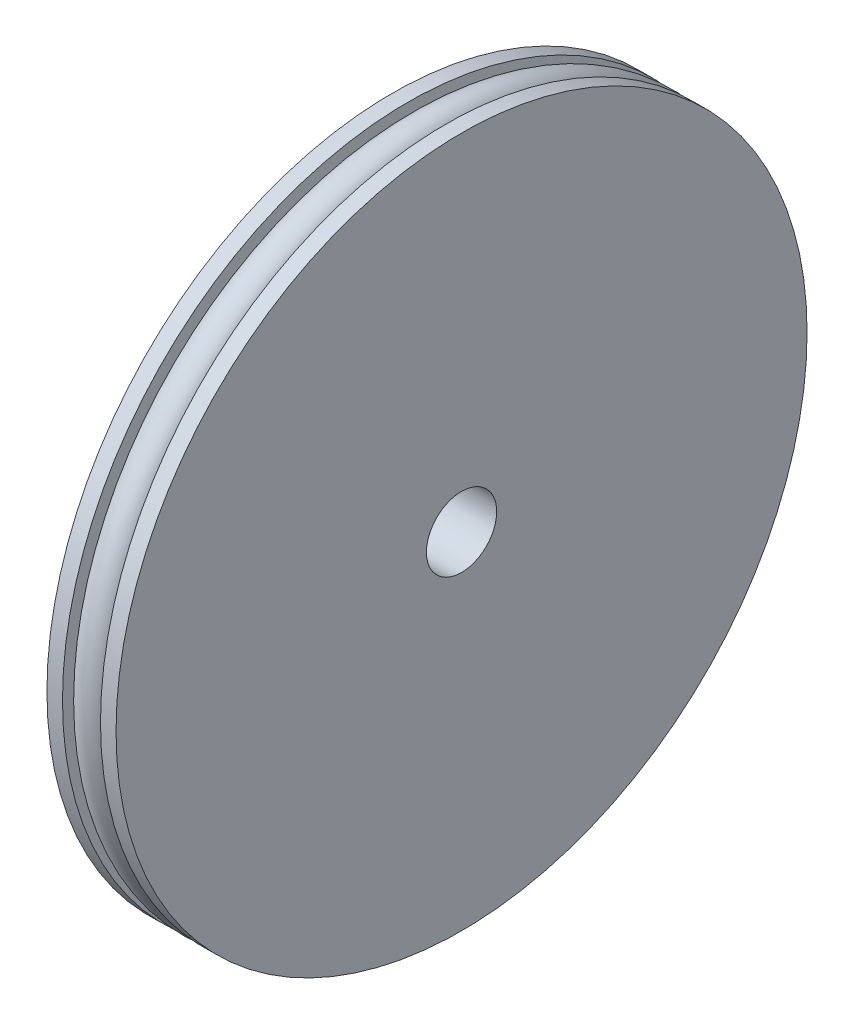
ISO-10303-21;
HEADER;
FILE_DESCRIPTION(('STEP AP214'),'2;1');
FILE_NAME('part.step','',(''),(''),'','','');
FILE_SCHEMA(('AUTOMOTIVE_DESIGN { 1 0 10303 214 1 1 1 1 }'));
ENDSEC;
DATA;
#1=APPLICATION_CONTEXT('core data for automotive mechanical design processes');
#2=APPLICATION_PROTOCOL_DEFINITION('international standard','automotive_design',2000,#1);
#3=PRODUCT_CONTEXT('',#1,'mechanical');
#4=PRODUCT('Part','Part','',(#3));
#5=PRODUCT_RELATED_PRODUCT_CATEGORY('part','',(#4));
#6=PRODUCT_DEFINITION_FORMATION('','',#4);
#7=PRODUCT_DEFINITION_CONTEXT('part definition',#1,'design');
#8=PRODUCT_DEFINITION('design','',#6,#7);
#9=PRODUCT_DEFINITION_SHAPE('','',#8);
#10=(LENGTH_UNIT() NAMED_UNIT(*) SI_UNIT(.MILLI.,.METRE.));
#11=(NAMED_UNIT(*) PLANE_ANGLE_UNIT() SI_UNIT($,.RADIAN.));
#12=(NAMED_UNIT(*) SI_UNIT($,.STERADIAN.) SOLID_ANGLE_UNIT());
#13=UNCERTAINTY_MEASURE_WITH_UNIT(LENGTH_MEASURE(1.E-05),#10,'distance_accuracy_value','');
#14=(GEOMETRIC_REPRESENTATION_CONTEXT(3) GLOBAL_UNCERTAINTY_ASSIGNED_CONTEXT((#13)) GLOBAL_UNIT_ASSIGNED_CONTEXT((#10,
#11,#12)) REPRESENTATION_CONTEXT('',''));
#15=CARTESIAN_POINT('',(0.,0.,0.));
#16=DIRECTION('',(0.,0.,1.));
#17=DIRECTION('',(1.,0.,0.));
#18=AXIS2_PLACEMENT_3D('',#15,#16,#17);
#19=CARTESIAN_POINT('',(-10.3308856444655,0.,0.));
#20=DIRECTION('',(-1.,0.,0.));
#21=DIRECTION('',(0.,0.,1.));
#22=AXIS2_PLACEMENT_3D('',#19,#20,#21);
#23=CYLINDRICAL_SURFACE('',#22,25.);
#24=CARTESIAN_POINT('',(1.35,0.,0.));
#25=DIRECTION('',(-1.,0.,0.));
#26=DIRECTION('',(0.,0.,1.));
#27=AXIS2_PLACEMENT_3D('',#24,#25,#26);
#28=CIRCLE('',#27,25.);
#29=CARTESIAN_POINT('',(1.35,0.,25.));
#30=VERTEX_POINT('',#29);
#31=EDGE_CURVE('E55',#30,#30,#28,.T.);
#32=ORIENTED_EDGE('',*,*,#31,.T.);
#33=EDGE_LOOP('',(#32));
#34=FACE_BOUND('',#33,.T.);
#35=CARTESIAN_POINT('',(4.65,0.,0.));
#36=DIRECTION('',(-1.,0.,0.));
#37=DIRECTION('',(0.,0.,1.));
#38=AXIS2_PLACEMENT_3D('',#35,#36,#37);
#39=CIRCLE('',#38,25.);
#40=CARTESIAN_POINT('',(4.65,0.,25.));
#41=VERTEX_POINT('',#40);
#42=EDGE_CURVE('E11',#41,#41,#39,.T.);
#43=ORIENTED_EDGE('',*,*,#42,.F.);
#44=EDGE_LOOP('',(#43));
#45=FACE_BOUND('',#44,.T.);
#46=ADVANCED_FACE('F41',(#34,#45),#23,.F.);
#47=CARTESIAN_POINT('',(4.65,25.,0.));
#48=DIRECTION('',(-1.,0.,0.));
#49=DIRECTION('',(0.,0.,1.));
#50=AXIS2_PLACEMENT_3D('',#47,#48,#49);
#51=PLANE('',#50);
#52=CARTESIAN_POINT('',(4.65,0.,0.));
#53=DIRECTION('',(-1.,0.,0.));
#54=DIRECTION('',(0.,0.,1.));
#55=AXIS2_PLACEMENT_3D('',#52,#53,#54);
#56=CIRCLE('',#55,28.35);
#57=CARTESIAN_POINT('',(4.65,0.,28.35));
#58=VERTEX_POINT('',#57);
#59=EDGE_CURVE('E47',#58,#58,#56,.T.);
#60=ORIENTED_EDGE('',*,*,#59,.F.);
#61=EDGE_LOOP('',(#60));
#62=FACE_BOUND('',#61,.T.);
#63=ORIENTED_EDGE('',*,*,#42,.T.);
#64=EDGE_LOOP('',(#63));
#65=FACE_BOUND('',#64,.T.);
#66=ADVANCED_FACE('F71',(#62,#65),#51,.F.);
#67=CARTESIAN_POINT('',(3.,0.,0.));
#68=DIRECTION('',(-1.,0.,0.));
#69=DIRECTION('',(0.,0.,1.));
#70=AXIS2_PLACEMENT_3D('',#67,#68,#69);
#71=TOROIDAL_SURFACE('',#70,28.35,1.65);
#72=CARTESIAN_POINT('',(1.35,0.,0.));
#73=DIRECTION('',(-1.,0.,0.));
#74=DIRECTION('',(0.,0.,1.));
#75=AXIS2_PLACEMENT_3D('',#72,#73,#74);
#76=CIRCLE('',#75,28.35);
#77=CARTESIAN_POINT('',(1.35,0.,28.35));
#78=VERTEX_POINT('',#77);
#79=EDGE_CURVE('E51',#78,#78,#76,.T.);
#80=ORIENTED_EDGE('',*,*,#79,.F.);
#81=EDGE_LOOP('',(#80));
#82=FACE_BOUND('',#81,.T.);
#83=ORIENTED_EDGE('',*,*,#59,.T.);
#84=EDGE_LOOP('',(#83));
#85=FACE_BOUND('',#84,.T.);
#86=ADVANCED_FACE('F65',(#82,#85),#71,.T.);
#87=CARTESIAN_POINT('',(1.35,25.,0.));
#88=DIRECTION('',(-1.,0.,0.));
#89=DIRECTION('',(0.,0.,1.));
#90=AXIS2_PLACEMENT_3D('',#87,#88,#89);
#91=PLANE('',#90);
#92=ORIENTED_EDGE('',*,*,#79,.T.);
#93=EDGE_LOOP('',(#92));
#94=FACE_BOUND('',#93,.T.);
#95=ORIENTED_EDGE('',*,*,#31,.F.);
#96=EDGE_LOOP('',(#95));
#97=FACE_BOUND('',#96,.T.);
#98=ADVANCED_FACE('F63',(#94,#97),#91,.T.);
#99=CLOSED_SHELL('',(#46,#66,#86,#98));
#100=MANIFOLD_SOLID_BREP('B2',#99);
#101=CARTESIAN_POINT('',(0.,0.,0.));
#102=DIRECTION('',(1.,0.,0.));
#103=DIRECTION('',(0.,0.,-1.));
#104=AXIS2_PLACEMENT_3D('',#101,#102,#103);
#105=PLANE('',#104);
#106=CARTESIAN_POINT('',(0.,0.,0.));
#107=DIRECTION('',(1.,0.,0.));
#108=DIRECTION('',(0.,0.,-1.));
#109=AXIS2_PLACEMENT_3D('',#106,#107,#108);
#110=CIRCLE('',#109,7.52277423873069);
#111=CARTESIAN_POINT('',(0.,0.,-7.52277423873069));
#112=VERTEX_POINT('',#111);
#113=EDGE_CURVE('E40',#112,#112,#110,.F.);
#114=ORIENTED_EDGE('',*,*,#113,.F.);
#115=EDGE_LOOP('',(#114));
#116=FACE_BOUND('',#115,.T.);
#117=CARTESIAN_POINT('',(0.,0.,0.));
#118=DIRECTION('',(-1.,0.,0.));
#119=DIRECTION('',(0.,0.,1.));
#120=AXIS2_PLACEMENT_3D('',#117,#118,#119);
#121=CIRCLE('',#120,30.);
#122=CARTESIAN_POINT('',(0.,0.,30.));
#123=VERTEX_POINT('',#122);
#124=EDGE_CURVE('E111',#123,#123,#121,.T.);
#125=ORIENTED_EDGE('',*,*,#124,.T.);
#126=EDGE_LOOP('',(#125));
#127=FACE_BOUND('',#126,.T.);
#128=ADVANCED_FACE('F105',(#116,#127),#105,.F.);
#129=CARTESIAN_POINT('',(0.,0.,0.));
#130=DIRECTION('',(-1.,0.,0.));
#131=DIRECTION('',(0.,0.,1.));
#132=AXIS2_PLACEMENT_3D('',#129,#130,#131);
#133=CYLINDRICAL_SURFACE('',#132,30.);
#134=ORIENTED_EDGE('',*,*,#124,.F.);
#135=EDGE_LOOP('',(#134));
#136=FACE_BOUND('',#135,.T.);
#137=CARTESIAN_POINT('',(1.35,0.,0.));
#138=DIRECTION('',(-1.,0.,0.));
#139=DIRECTION('',(0.,0.,1.));
#140=AXIS2_PLACEMENT_3D('',#137,#138,#139);
#141=CIRCLE('',#140,30.);
#142=CARTESIAN_POINT('',(1.35,0.,30.));
#143=VERTEX_POINT('',#142);
#144=EDGE_CURVE('E115',#143,#143,#141,.T.);
#145=ORIENTED_EDGE('',*,*,#144,.T.);
#146=EDGE_LOOP('',(#145));
#147=FACE_BOUND('',#146,.T.);
#148=ADVANCED_FACE('F167',(#136,#147),#133,.T.);
#149=CARTESIAN_POINT('',(1.35,30.,0.));
#150=DIRECTION('',(-1.,0.,0.));
#151=DIRECTION('',(0.,0.,1.));
#152=AXIS2_PLACEMENT_3D('',#149,#150,#151);
#153=PLANE('',#152);
#154=ORIENTED_EDGE('',*,*,#144,.F.);
#155=EDGE_LOOP('',(#154));
#156=FACE_BOUND('',#155,.T.);
#157=CARTESIAN_POINT('',(1.35,0.,0.));
#158=DIRECTION('',(-1.,0.,0.));
#159=DIRECTION('',(0.,0.,1.));
#160=AXIS2_PLACEMENT_3D('',#157,#158,#159);
#161=CIRCLE('',#160,25.);
#162=CARTESIAN_POINT('',(1.35,0.,25.));
#163=VERTEX_POINT('',#162);
#164=EDGE_CURVE('E119',#163,#163,#161,.T.);
#165=ORIENTED_EDGE('',*,*,#164,.T.);
#166=EDGE_LOOP('',(#165));
#167=FACE_BOUND('',#166,.T.);
#168=ADVANCED_FACE('F172',(#156,#167),#153,.F.);
#169=CARTESIAN_POINT('',(0.,0.,0.));
#170=DIRECTION('',(-1.,0.,0.));
#171=DIRECTION('',(0.,0.,1.));
#172=AXIS2_PLACEMENT_3D('',#169,#170,#171);
#173=CYLINDRICAL_SURFACE('',#172,25.);
#174=ORIENTED_EDGE('',*,*,#164,.F.);
#175=EDGE_LOOP('',(#174));
#176=FACE_BOUND('',#175,.T.);
#177=CARTESIAN_POINT('',(4.65,0.,0.));
#178=DIRECTION('',(-1.,0.,0.));
#179=DIRECTION('',(0.,0.,1.));
#180=AXIS2_PLACEMENT_3D('',#177,#178,#179);
#181=CIRCLE('',#180,25.);
#182=CARTESIAN_POINT('',(4.65,0.,25.));
#183=VERTEX_POINT('',#182);
#184=EDGE_CURVE('E124',#183,#183,#181,.T.);
#185=ORIENTED_EDGE('',*,*,#184,.T.);
#186=EDGE_LOOP('',(#185));
#187=FACE_BOUND('',#186,.T.);
#188=ADVANCED_FACE('F177',(#176,#187),#173,.T.);
#189=CARTESIAN_POINT('',(4.65,25.,0.));
#190=DIRECTION('',(1.,0.,0.));
#191=DIRECTION('',(0.,0.,-1.));
#192=AXIS2_PLACEMENT_3D('',#189,#190,#191);
#193=PLANE('',#192);
#194=ORIENTED_EDGE('',*,*,#184,.F.);
#195=EDGE_LOOP('',(#194));
#196=FACE_BOUND('',#195,.T.);
#197=CARTESIAN_POINT('',(4.65,0.,0.));
#198=DIRECTION('',(-1.,0.,0.));
#199=DIRECTION('',(0.,0.,1.));
#200=AXIS2_PLACEMENT_3D('',#197,#198,#199);
#201=CIRCLE('',#200,30.);
#202=CARTESIAN_POINT('',(4.65,0.,30.));
#203=VERTEX_POINT('',#202);
#204=EDGE_CURVE('E127',#203,#203,#201,.T.);
#205=ORIENTED_EDGE('',*,*,#204,.T.);
#206=EDGE_LOOP('',(#205));
#207=FACE_BOUND('',#206,.T.);
#208=ADVANCED_FACE('F184',(#196,#207),#193,.F.);
#209=CARTESIAN_POINT('',(0.,0.,0.));
#210=DIRECTION('',(-1.,0.,0.));
#211=DIRECTION('',(0.,0.,1.));
#212=AXIS2_PLACEMENT_3D('',#209,#210,#211);
#213=CYLINDRICAL_SURFACE('',#212,30.);
#214=ORIENTED_EDGE('',*,*,#204,.F.);
#215=EDGE_LOOP('',(#214));
#216=FACE_BOUND('',#215,.T.);
#217=CARTESIAN_POINT('',(6.,0.,0.));
#218=DIRECTION('',(-1.,0.,0.));
#219=DIRECTION('',(0.,0.,1.));
#220=AXIS2_PLACEMENT_3D('',#217,#218,#219);
#221=CIRCLE('',#220,30.);
#222=CARTESIAN_POINT('',(6.,0.,30.));
#223=VERTEX_POINT('',#222);
#224=EDGE_CURVE('E130',#223,#223,#221,.T.);
#225=ORIENTED_EDGE('',*,*,#224,.T.);
#226=EDGE_LOOP('',(#225));
#227=FACE_BOUND('',#226,.T.);
#228=ADVANCED_FACE('F164',(#216,#227),#213,.T.);
#229=CARTESIAN_POINT('',(6.,0.,0.));
#230=DIRECTION('',(-1.,0.,0.));
#231=DIRECTION('',(0.,0.,1.));
#232=AXIS2_PLACEMENT_3D('',#229,#230,#231);
#233=PLANE('',#232);
#234=CARTESIAN_POINT('',(6.,0.,0.));
#235=DIRECTION('',(-1.,0.,0.));
#236=DIRECTION('',(0.,0.,1.));
#237=AXIS2_PLACEMENT_3D('',#234,#235,#236);
#238=CIRCLE('',#237,3.05);
#239=CARTESIAN_POINT('',(6.,0.,3.05));
#240=VERTEX_POINT('',#239);
#241=EDGE_CURVE('E136',#240,#240,#238,.T.);
#242=ORIENTED_EDGE('',*,*,#241,.T.);
#243=EDGE_LOOP('',(#242));
#244=FACE_BOUND('',#243,.T.);
#245=ORIENTED_EDGE('',*,*,#224,.F.);
#246=EDGE_LOOP('',(#245));
#247=FACE_BOUND('',#246,.T.);
#248=ADVANCED_FACE('F143',(#244,#247),#233,.F.);
#249=CARTESIAN_POINT('',(-8.,0.,0.));
#250=DIRECTION('',(1.,0.,0.));
#251=DIRECTION('',(0.,0.,-1.));
#252=AXIS2_PLACEMENT_3D('',#249,#250,#251);
#253=CYLINDRICAL_SURFACE('',#252,7.52277423873069);
#254=CARTESIAN_POINT('',(-8.,0.,0.));
#255=DIRECTION('',(-1.,0.,0.));
#256=DIRECTION('',(0.,0.,1.));
#257=AXIS2_PLACEMENT_3D('',#254,#255,#256);
#258=CIRCLE('',#257,7.52277423873069);
#259=CARTESIAN_POINT('',(-8.,0.,7.52277423873069));
#260=VERTEX_POINT('',#259);
#261=EDGE_CURVE('E133',#260,#260,#258,.T.);
#262=ORIENTED_EDGE('',*,*,#261,.F.);
#263=EDGE_LOOP('',(#262));
#264=FACE_BOUND('',#263,.T.);
#265=ORIENTED_EDGE('',*,*,#113,.T.);
#266=EDGE_LOOP('',(#265));
#267=FACE_BOUND('',#266,.T.);
#268=ADVANCED_FACE('F155',(#264,#267),#253,.T.);
#269=CARTESIAN_POINT('',(-8.,0.,0.));
#270=DIRECTION('',(-1.,0.,0.));
#271=DIRECTION('',(0.,0.,1.));
#272=AXIS2_PLACEMENT_3D('',#269,#270,#271);
#273=PLANE('',#272);
#274=CARTESIAN_POINT('',(-8.,0.,0.));
#275=DIRECTION('',(-1.,0.,0.));
#276=DIRECTION('',(0.,0.,1.));
#277=AXIS2_PLACEMENT_3D('',#274,#275,#276);
#278=CIRCLE('',#277,3.05);
#279=CARTESIAN_POINT('',(-8.,0.,3.05));
#280=VERTEX_POINT('',#279);
#281=EDGE_CURVE('E137',#280,#280,#278,.T.);
#282=ORIENTED_EDGE('',*,*,#281,.F.);
#283=EDGE_LOOP('',(#282));
#284=FACE_BOUND('',#283,.T.);
#285=ORIENTED_EDGE('',*,*,#261,.T.);
#286=EDGE_LOOP('',(#285));
#287=FACE_BOUND('',#286,.T.);
#288=ADVANCED_FACE('F149',(#284,#287),#273,.T.);
#289=CARTESIAN_POINT('',(6.,0.,0.));
#290=DIRECTION('',(-1.,0.,0.));
#291=DIRECTION('',(0.,0.,1.));
#292=AXIS2_PLACEMENT_3D('',#289,#290,#291);
#293=CYLINDRICAL_SURFACE('',#292,3.05);
#294=ORIENTED_EDGE('',*,*,#241,.F.);
#295=EDGE_LOOP('',(#294));
#296=FACE_BOUND('',#295,.T.);
#297=ORIENTED_EDGE('',*,*,#281,.T.);
#298=EDGE_LOOP('',(#297));
#299=FACE_BOUND('',#298,.T.);
#300=ADVANCED_FACE('F146',(#296,#299),#293,.F.);
#301=CLOSED_SHELL('',(#128,#148,#168,#188,#208,#228,#248,#268,#288,#300));
#302=MANIFOLD_SOLID_BREP('B6',#301);
#303=ADVANCED_BREP_SHAPE_REPRESENTATION('',(#18,#100,#302),#14);
#304=SHAPE_DEFINITION_REPRESENTATION(#9,#303);
ENDSEC;
END-ISO-10303-21;
